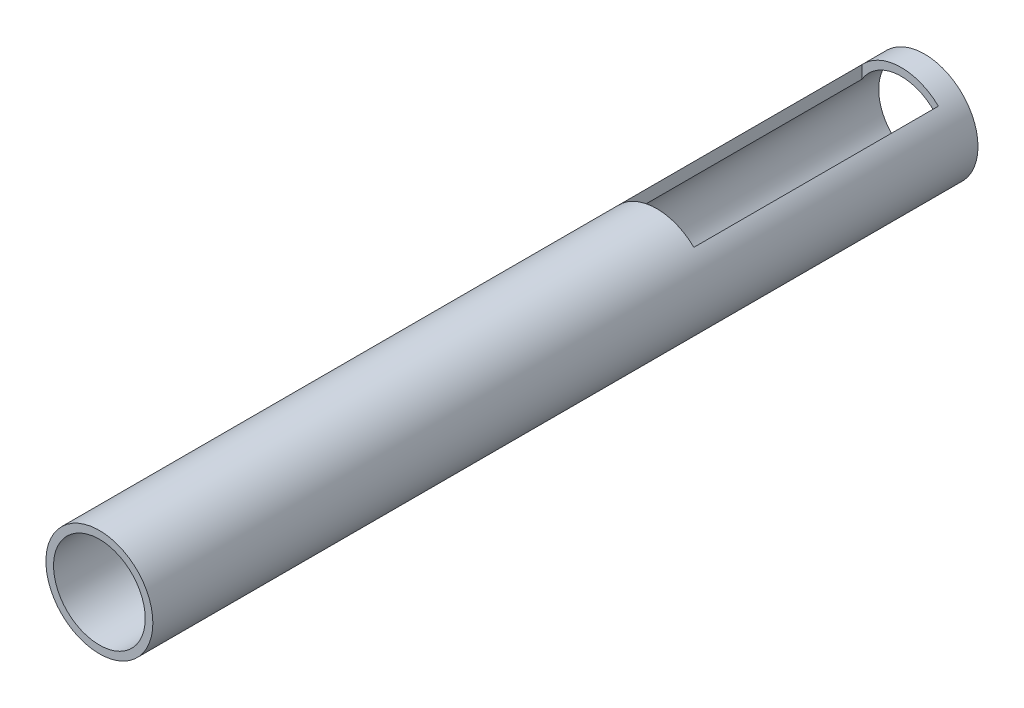
ISO-10303-21;
HEADER;
FILE_DESCRIPTION(('STEP AP214'),'2;1');
FILE_NAME('part.step','',(''),(''),'','','');
FILE_SCHEMA(('AUTOMOTIVE_DESIGN { 1 0 10303 214 1 1 1 1 }'));
ENDSEC;
DATA;
#1=APPLICATION_CONTEXT('core data for automotive mechanical design processes');
#2=APPLICATION_PROTOCOL_DEFINITION('international standard','automotive_design',2000,#1);
#3=PRODUCT_CONTEXT('',#1,'mechanical');
#4=PRODUCT('Part','Part','',(#3));
#5=PRODUCT_RELATED_PRODUCT_CATEGORY('part','',(#4));
#6=PRODUCT_DEFINITION_FORMATION('','',#4);
#7=PRODUCT_DEFINITION_CONTEXT('part definition',#1,'design');
#8=PRODUCT_DEFINITION('design','',#6,#7);
#9=PRODUCT_DEFINITION_SHAPE('','',#8);
#10=(LENGTH_UNIT() NAMED_UNIT(*) SI_UNIT(.MILLI.,.METRE.));
#11=(NAMED_UNIT(*) PLANE_ANGLE_UNIT() SI_UNIT($,.RADIAN.));
#12=(NAMED_UNIT(*) SI_UNIT($,.STERADIAN.) SOLID_ANGLE_UNIT());
#13=UNCERTAINTY_MEASURE_WITH_UNIT(LENGTH_MEASURE(1.E-05),#10,'distance_accuracy_value','');
#14=(GEOMETRIC_REPRESENTATION_CONTEXT(3) GLOBAL_UNCERTAINTY_ASSIGNED_CONTEXT((#13)) GLOBAL_UNIT_ASSIGNED_CONTEXT((#10,
#11,#12)) REPRESENTATION_CONTEXT('',''));
#15=CARTESIAN_POINT('',(0.,0.,0.));
#16=DIRECTION('',(0.,0.,1.));
#17=DIRECTION('',(1.,0.,0.));
#18=AXIS2_PLACEMENT_3D('',#15,#16,#17);
#19=CARTESIAN_POINT('',(0.,0.,685.8));
#20=DIRECTION('',(0.,0.,-1.));
#21=DIRECTION('',(-1.,0.,0.));
#22=AXIS2_PLACEMENT_3D('',#19,#20,#21);
#23=CYLINDRICAL_SURFACE('',#22,44.45);
#24=CARTESIAN_POINT('',(0.,0.,0.));
#25=DIRECTION('',(0.,0.,1.));
#26=DIRECTION('',(1.,0.,0.));
#27=AXIS2_PLACEMENT_3D('',#24,#25,#26);
#28=CIRCLE('',#27,44.45);
#29=CARTESIAN_POINT('',(44.45,0.,0.));
#30=VERTEX_POINT('',#29);
#31=EDGE_CURVE('E96',#30,#30,#28,.T.);
#32=ORIENTED_EDGE('',*,*,#31,.T.);
#33=EDGE_LOOP('',(#32));
#34=FACE_BOUND('',#33,.T.);
#35=CARTESIAN_POINT('',(0.,0.,685.8));
#36=DIRECTION('',(0.,0.,1.));
#37=DIRECTION('',(1.,0.,0.));
#38=AXIS2_PLACEMENT_3D('',#35,#36,#37);
#39=CIRCLE('',#38,44.45);
#40=CARTESIAN_POINT('',(44.45,0.,685.8));
#41=VERTEX_POINT('',#40);
#42=EDGE_CURVE('E98',#41,#41,#39,.T.);
#43=ORIENTED_EDGE('',*,*,#42,.F.);
#44=EDGE_LOOP('',(#43));
#45=FACE_BOUND('',#44,.T.);
#46=DIRECTION('',(0.,0.,-1.));
#47=VECTOR('',#46,1.);
#48=CARTESIAN_POINT('',(-32.6424269474126,30.1707550946746,685.8));
#49=LINE('',#48,#47);
#50=CARTESIAN_POINT('',(-32.6424269474127,30.1707550946745,19.3530551325796));
#51=VERTEX_POINT('',#50);
#52=CARTESIAN_POINT('',(-32.6424269474127,30.1707550946745,222.55305513258));
#53=VERTEX_POINT('',#52);
#54=EDGE_CURVE('E81',#51,#53,#49,.F.);
#55=ORIENTED_EDGE('',*,*,#54,.F.);
#56=CARTESIAN_POINT('',(0.,0.,19.3530551325796));
#57=DIRECTION('',(0.,0.,1.));
#58=DIRECTION('',(1.,0.,0.));
#59=AXIS2_PLACEMENT_3D('',#56,#57,#58);
#60=CIRCLE('',#59,44.45);
#61=CARTESIAN_POINT('',(30.8575730525873,31.9939476355175,19.3530551325796));
#62=VERTEX_POINT('',#61);
#63=EDGE_CURVE('E70',#62,#51,#60,.T.);
#64=ORIENTED_EDGE('',*,*,#63,.F.);
#65=DIRECTION('',(0.,0.,-1.));
#66=VECTOR('',#65,1.);
#67=CARTESIAN_POINT('',(30.8575730525874,31.9939476355174,685.8));
#68=LINE('',#67,#66);
#69=CARTESIAN_POINT('',(30.8575730525873,31.9939476355174,222.55305513258));
#70=VERTEX_POINT('',#69);
#71=EDGE_CURVE('E75',#70,#62,#68,.T.);
#72=ORIENTED_EDGE('',*,*,#71,.F.);
#73=CARTESIAN_POINT('',(0.,0.,222.55305513258));
#74=DIRECTION('',(0.,0.,-1.));
#75=DIRECTION('',(-1.,0.,0.));
#76=AXIS2_PLACEMENT_3D('',#73,#74,#75);
#77=CIRCLE('',#76,44.45);
#78=EDGE_CURVE('E86',#53,#70,#77,.T.);
#79=ORIENTED_EDGE('',*,*,#78,.F.);
#80=EDGE_LOOP('',(#55,#64,#72,#79));
#81=FACE_BOUND('',#80,.T.);
#82=ADVANCED_FACE('F33',(#34,#45,#81),#23,.T.);
#83=CARTESIAN_POINT('',(0.,0.,685.8));
#84=DIRECTION('',(0.,0.,-1.));
#85=DIRECTION('',(-1.,0.,0.));
#86=AXIS2_PLACEMENT_3D('',#83,#84,#85);
#87=CYLINDRICAL_SURFACE('',#86,38.1);
#88=CARTESIAN_POINT('',(0.,0.,685.8));
#89=DIRECTION('',(0.,0.,1.));
#90=DIRECTION('',(1.,0.,0.));
#91=AXIS2_PLACEMENT_3D('',#88,#89,#90);
#92=CIRCLE('',#91,38.1);
#93=CARTESIAN_POINT('',(38.1,0.,685.8));
#94=VERTEX_POINT('',#93);
#95=EDGE_CURVE('E90',#94,#94,#92,.T.);
#96=ORIENTED_EDGE('',*,*,#95,.T.);
#97=EDGE_LOOP('',(#96));
#98=FACE_BOUND('',#97,.T.);
#99=CARTESIAN_POINT('',(0.,0.,0.));
#100=DIRECTION('',(0.,0.,1.));
#101=DIRECTION('',(1.,0.,0.));
#102=AXIS2_PLACEMENT_3D('',#99,#100,#101);
#103=CIRCLE('',#102,38.1);
#104=CARTESIAN_POINT('',(38.1,0.,0.));
#105=VERTEX_POINT('',#104);
#106=EDGE_CURVE('E87',#105,#105,#103,.T.);
#107=ORIENTED_EDGE('',*,*,#106,.F.);
#108=EDGE_LOOP('',(#107));
#109=FACE_BOUND('',#108,.T.);
#110=CARTESIAN_POINT('',(0.,0.,19.3530551325796));
#111=DIRECTION('',(0.,0.,1.));
#112=DIRECTION('',(1.,0.,0.));
#113=AXIS2_PLACEMENT_3D('',#110,#111,#112);
#114=CIRCLE('',#113,38.1);
#115=CARTESIAN_POINT('',(30.8575730525873,22.3477109634128,19.3530551325796));
#116=VERTEX_POINT('',#115);
#117=CARTESIAN_POINT('',(-32.6424269474127,19.6489684966622,19.3530551325796));
#118=VERTEX_POINT('',#117);
#119=EDGE_CURVE('E101',#116,#118,#114,.T.);
#120=ORIENTED_EDGE('',*,*,#119,.T.);
#121=DIRECTION('',(0.,0.,-1.));
#122=VECTOR('',#121,1.);
#123=CARTESIAN_POINT('',(-32.6424269474126,19.6489684966624,685.8));
#124=LINE('',#123,#122);
#125=CARTESIAN_POINT('',(-32.6424269474127,19.6489684966623,222.55305513258));
#126=VERTEX_POINT('',#125);
#127=EDGE_CURVE('E11',#118,#126,#124,.F.);
#128=ORIENTED_EDGE('',*,*,#127,.T.);
#129=CARTESIAN_POINT('',(0.,0.,222.55305513258));
#130=DIRECTION('',(0.,0.,-1.));
#131=DIRECTION('',(-1.,0.,0.));
#132=AXIS2_PLACEMENT_3D('',#129,#130,#131);
#133=CIRCLE('',#132,38.1);
#134=CARTESIAN_POINT('',(30.8575730525873,22.3477109634126,222.55305513258));
#135=VERTEX_POINT('',#134);
#136=EDGE_CURVE('E40',#126,#135,#133,.T.);
#137=ORIENTED_EDGE('',*,*,#136,.T.);
#138=DIRECTION('',(0.,0.,-1.));
#139=VECTOR('',#138,1.);
#140=CARTESIAN_POINT('',(30.8575730525874,22.3477109634126,685.8));
#141=LINE('',#140,#139);
#142=EDGE_CURVE('E105',#135,#116,#141,.T.);
#143=ORIENTED_EDGE('',*,*,#142,.T.);
#144=EDGE_LOOP('',(#120,#128,#137,#143));
#145=FACE_BOUND('',#144,.T.);
#146=ADVANCED_FACE('F109',(#98,#109,#145),#87,.F.);
#147=CARTESIAN_POINT('',(0.,0.,685.8));
#148=DIRECTION('',(0.,0.,1.));
#149=DIRECTION('',(1.,0.,0.));
#150=AXIS2_PLACEMENT_3D('',#147,#148,#149);
#151=PLANE('',#150);
#152=ORIENTED_EDGE('',*,*,#42,.T.);
#153=EDGE_LOOP('',(#152));
#154=FACE_BOUND('',#153,.T.);
#155=ORIENTED_EDGE('',*,*,#95,.F.);
#156=EDGE_LOOP('',(#155));
#157=FACE_BOUND('',#156,.T.);
#158=ADVANCED_FACE('F133',(#154,#157),#151,.T.);
#159=CARTESIAN_POINT('',(0.,0.,0.));
#160=DIRECTION('',(0.,0.,1.));
#161=DIRECTION('',(1.,0.,0.));
#162=AXIS2_PLACEMENT_3D('',#159,#160,#161);
#163=PLANE('',#162);
#164=ORIENTED_EDGE('',*,*,#31,.F.);
#165=EDGE_LOOP('',(#164));
#166=FACE_BOUND('',#165,.T.);
#167=ORIENTED_EDGE('',*,*,#106,.T.);
#168=EDGE_LOOP('',(#167));
#169=FACE_BOUND('',#168,.T.);
#170=ADVANCED_FACE('F142',(#166,#169),#163,.F.);
#171=CARTESIAN_POINT('',(-32.6424269474127,685.8,19.3530551325796));
#172=DIRECTION('',(1.,0.,0.));
#173=DIRECTION('',(0.,0.,-1.));
#174=AXIS2_PLACEMENT_3D('',#171,#172,#173);
#175=PLANE('',#174);
#176=ORIENTED_EDGE('',*,*,#54,.T.);
#177=DIRECTION('',(0.,-1.,0.));
#178=VECTOR('',#177,1.);
#179=CARTESIAN_POINT('',(-32.6424269474127,685.8,222.55305513258));
#180=LINE('',#179,#178);
#181=EDGE_CURVE('E76',#53,#126,#180,.T.);
#182=ORIENTED_EDGE('',*,*,#181,.T.);
#183=ORIENTED_EDGE('',*,*,#127,.F.);
#184=DIRECTION('',(0.,-1.,0.));
#185=VECTOR('',#184,1.);
#186=CARTESIAN_POINT('',(-32.6424269474127,685.8,19.3530551325796));
#187=LINE('',#186,#185);
#188=EDGE_CURVE('E52',#51,#118,#187,.T.);
#189=ORIENTED_EDGE('',*,*,#188,.F.);
#190=EDGE_LOOP('',(#176,#182,#183,#189));
#191=FACE_BOUND('',#190,.T.);
#192=ADVANCED_FACE('F79',(#191),#175,.T.);
#193=CARTESIAN_POINT('',(-32.6424269474127,685.8,222.55305513258));
#194=DIRECTION('',(0.,0.,-1.));
#195=DIRECTION('',(-1.,0.,0.));
#196=AXIS2_PLACEMENT_3D('',#193,#194,#195);
#197=PLANE('',#196);
#198=ORIENTED_EDGE('',*,*,#78,.T.);
#199=DIRECTION('',(0.,-1.,0.));
#200=VECTOR('',#199,1.);
#201=CARTESIAN_POINT('',(30.8575730525873,685.8,222.55305513258));
#202=LINE('',#201,#200);
#203=EDGE_CURVE('E114',#70,#135,#202,.T.);
#204=ORIENTED_EDGE('',*,*,#203,.T.);
#205=ORIENTED_EDGE('',*,*,#136,.F.);
#206=ORIENTED_EDGE('',*,*,#181,.F.);
#207=EDGE_LOOP('',(#198,#204,#205,#206));
#208=FACE_BOUND('',#207,.T.);
#209=ADVANCED_FACE('F112',(#208),#197,.T.);
#210=CARTESIAN_POINT('',(30.8575730525873,685.8,19.3530551325796));
#211=DIRECTION('',(-1.,0.,0.));
#212=DIRECTION('',(0.,0.,1.));
#213=AXIS2_PLACEMENT_3D('',#210,#211,#212);
#214=PLANE('',#213);
#215=ORIENTED_EDGE('',*,*,#71,.T.);
#216=DIRECTION('',(0.,-1.,0.));
#217=VECTOR('',#216,1.);
#218=CARTESIAN_POINT('',(30.8575730525873,685.8,19.3530551325796));
#219=LINE('',#218,#217);
#220=EDGE_CURVE('E47',#62,#116,#219,.T.);
#221=ORIENTED_EDGE('',*,*,#220,.T.);
#222=ORIENTED_EDGE('',*,*,#142,.F.);
#223=ORIENTED_EDGE('',*,*,#203,.F.);
#224=EDGE_LOOP('',(#215,#221,#222,#223));
#225=FACE_BOUND('',#224,.T.);
#226=ADVANCED_FACE('F119',(#225),#214,.T.);
#227=CARTESIAN_POINT('',(-32.6424269474127,685.8,19.3530551325796));
#228=DIRECTION('',(0.,0.,1.));
#229=DIRECTION('',(1.,0.,0.));
#230=AXIS2_PLACEMENT_3D('',#227,#228,#229);
#231=PLANE('',#230);
#232=ORIENTED_EDGE('',*,*,#63,.T.);
#233=ORIENTED_EDGE('',*,*,#188,.T.);
#234=ORIENTED_EDGE('',*,*,#119,.F.);
#235=ORIENTED_EDGE('',*,*,#220,.F.);
#236=EDGE_LOOP('',(#232,#233,#234,#235));
#237=FACE_BOUND('',#236,.T.);
#238=ADVANCED_FACE('F71',(#237),#231,.T.);
#239=CLOSED_SHELL('',(#82,#146,#158,#170,#192,#209,#226,#238));
#240=MANIFOLD_SOLID_BREP('B2',#239);
#241=ADVANCED_BREP_SHAPE_REPRESENTATION('',(#18,#240),#14);
#242=SHAPE_DEFINITION_REPRESENTATION(#9,#241);
ENDSEC;
END-ISO-10303-21;
